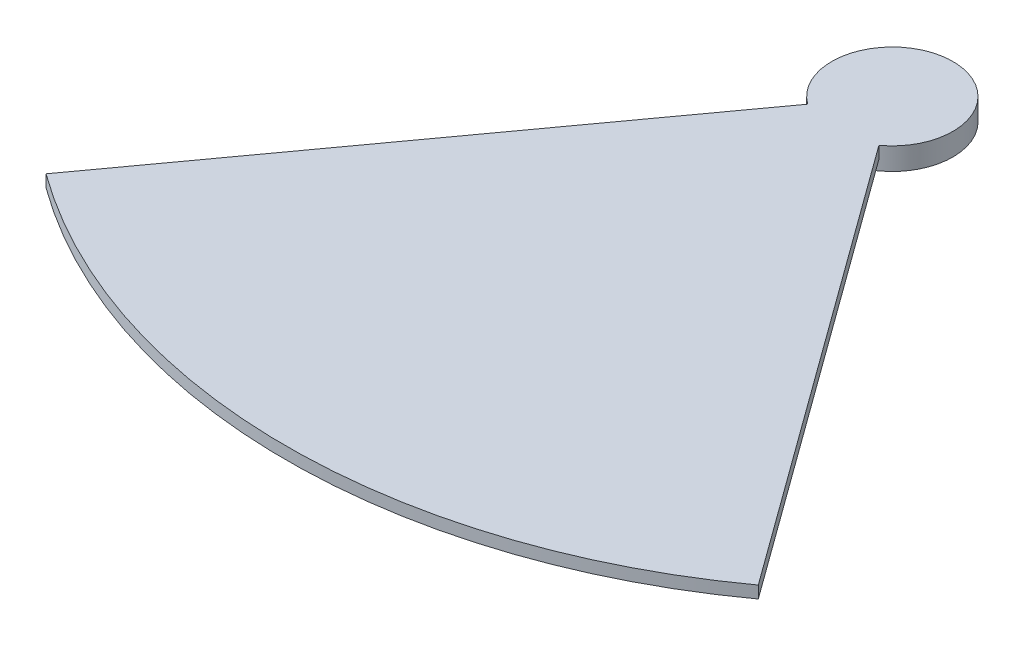
ISO-10303-21;
HEADER;
FILE_DESCRIPTION(('STEP AP214'),'2;1');
FILE_NAME('part.step','',(''),(''),'','','');
FILE_SCHEMA(('AUTOMOTIVE_DESIGN { 1 0 10303 214 1 1 1 1 }'));
ENDSEC;
DATA;
#1=APPLICATION_CONTEXT('core data for automotive mechanical design processes');
#2=APPLICATION_PROTOCOL_DEFINITION('international standard','automotive_design',2000,#1);
#3=PRODUCT_CONTEXT('',#1,'mechanical');
#4=PRODUCT('Part','Part','',(#3));
#5=PRODUCT_RELATED_PRODUCT_CATEGORY('part','',(#4));
#6=PRODUCT_DEFINITION_FORMATION('','',#4);
#7=PRODUCT_DEFINITION_CONTEXT('part definition',#1,'design');
#8=PRODUCT_DEFINITION('design','',#6,#7);
#9=PRODUCT_DEFINITION_SHAPE('','',#8);
#10=(LENGTH_UNIT() NAMED_UNIT(*) SI_UNIT(.MILLI.,.METRE.));
#11=(NAMED_UNIT(*) PLANE_ANGLE_UNIT() SI_UNIT($,.RADIAN.));
#12=(NAMED_UNIT(*) SI_UNIT($,.STERADIAN.) SOLID_ANGLE_UNIT());
#13=UNCERTAINTY_MEASURE_WITH_UNIT(LENGTH_MEASURE(1.E-05),#10,'distance_accuracy_value','');
#14=(GEOMETRIC_REPRESENTATION_CONTEXT(3) GLOBAL_UNCERTAINTY_ASSIGNED_CONTEXT((#13)) GLOBAL_UNIT_ASSIGNED_CONTEXT((#10,
#11,#12)) REPRESENTATION_CONTEXT('',''));
#15=CARTESIAN_POINT('',(0.,0.,0.));
#16=DIRECTION('',(0.,0.,1.));
#17=DIRECTION('',(1.,0.,0.));
#18=AXIS2_PLACEMENT_3D('',#15,#16,#17);
#19=CARTESIAN_POINT('',(0.,0.,0.));
#20=DIRECTION('',(0.,1.,0.));
#21=DIRECTION('',(0.,0.,1.));
#22=AXIS2_PLACEMENT_3D('',#19,#20,#21);
#23=PLANE('',#22);
#24=CARTESIAN_POINT('',(0.,0.,0.));
#25=DIRECTION('',(0.,1.,0.));
#26=DIRECTION('',(0.,0.,1.));
#27=AXIS2_PLACEMENT_3D('',#24,#25,#26);
#28=CIRCLE('',#27,6.);
#29=CARTESIAN_POINT('',(0.,0.,6.));
#30=VERTEX_POINT('',#29);
#31=EDGE_CURVE('E43',#30,#30,#28,.T.);
#32=ORIENTED_EDGE('',*,*,#31,.F.);
#33=EDGE_LOOP('',(#32));
#34=FACE_BOUND('',#33,.T.);
#35=CARTESIAN_POINT('',(0.,0.,0.));
#36=DIRECTION('',(0.,1.,0.));
#37=DIRECTION('',(0.,0.,1.));
#38=AXIS2_PLACEMENT_3D('',#35,#36,#37);
#39=CIRCLE('',#38,3.175);
#40=CARTESIAN_POINT('',(0.,0.,3.175));
#41=VERTEX_POINT('',#40);
#42=EDGE_CURVE('E138',#41,#41,#39,.T.);
#43=ORIENTED_EDGE('',*,*,#42,.T.);
#44=EDGE_LOOP('',(#43));
#45=FACE_BOUND('',#44,.T.);
#46=ADVANCED_FACE('F39',(#34,#45),#23,.F.);
#47=CARTESIAN_POINT('',(0.,16.,0.));
#48=DIRECTION('',(0.,-1.,0.));
#49=DIRECTION('',(0.,0.,-1.));
#50=AXIS2_PLACEMENT_3D('',#47,#48,#49);
#51=CYLINDRICAL_SURFACE('',#50,6.);
#52=CARTESIAN_POINT('',(0.,16.,0.));
#53=DIRECTION('',(0.,1.,0.));
#54=DIRECTION('',(0.,0.,1.));
#55=AXIS2_PLACEMENT_3D('',#52,#53,#54);
#56=CIRCLE('',#55,6.);
#57=CARTESIAN_POINT('',(0.,16.,6.));
#58=VERTEX_POINT('',#57);
#59=EDGE_CURVE('E11',#58,#58,#56,.T.);
#60=ORIENTED_EDGE('',*,*,#59,.F.);
#61=EDGE_LOOP('',(#60));
#62=FACE_BOUND('',#61,.T.);
#63=ORIENTED_EDGE('',*,*,#31,.T.);
#64=EDGE_LOOP('',(#63));
#65=FACE_BOUND('',#64,.T.);
#66=ADVANCED_FACE('F41',(#62,#65),#51,.T.);
#67=CARTESIAN_POINT('',(0.,16.,0.));
#68=DIRECTION('',(0.,-1.,0.));
#69=DIRECTION('',(0.,0.,-1.));
#70=AXIS2_PLACEMENT_3D('',#67,#68,#69);
#71=CYLINDRICAL_SURFACE('',#70,3.175);
#72=CARTESIAN_POINT('',(0.,16.,0.));
#73=DIRECTION('',(0.,1.,0.));
#74=DIRECTION('',(0.,0.,1.));
#75=AXIS2_PLACEMENT_3D('',#72,#73,#74);
#76=CIRCLE('',#75,3.175);
#77=CARTESIAN_POINT('',(0.,16.,3.175));
#78=VERTEX_POINT('',#77);
#79=EDGE_CURVE('E131',#78,#78,#76,.T.);
#80=ORIENTED_EDGE('',*,*,#79,.T.);
#81=EDGE_LOOP('',(#80));
#82=FACE_BOUND('',#81,.T.);
#83=ORIENTED_EDGE('',*,*,#42,.F.);
#84=EDGE_LOOP('',(#83));
#85=FACE_BOUND('',#84,.T.);
#86=ADVANCED_FACE('F152',(#82,#85),#71,.F.);
#87=CARTESIAN_POINT('',(0.,16.,0.));
#88=DIRECTION('',(0.,1.,0.));
#89=DIRECTION('',(0.,0.,1.));
#90=AXIS2_PLACEMENT_3D('',#87,#88,#89);
#91=PLANE('',#90);
#92=ORIENTED_EDGE('',*,*,#79,.F.);
#93=EDGE_LOOP('',(#92));
#94=FACE_BOUND('',#93,.T.);
#95=ADVANCED_FACE('F157',(#94),#91,.F.);
#96=CARTESIAN_POINT('',(0.,21.,0.));
#97=DIRECTION('',(0.,-1.,0.));
#98=DIRECTION('',(0.,0.,-1.));
#99=AXIS2_PLACEMENT_3D('',#96,#97,#98);
#100=CYLINDRICAL_SURFACE('',#99,30.);
#101=CARTESIAN_POINT('',(0.,21.,0.));
#102=DIRECTION('',(0.,1.,0.));
#103=DIRECTION('',(0.,0.,1.));
#104=AXIS2_PLACEMENT_3D('',#101,#102,#103);
#105=CIRCLE('',#104,30.);
#106=CARTESIAN_POINT('',(-17.6335575687744,21.,24.2705098312483));
#107=VERTEX_POINT('',#106);
#108=CARTESIAN_POINT('',(17.6335575687741,21.,24.2705098312485));
#109=VERTEX_POINT('',#108);
#110=EDGE_CURVE('E55',#107,#109,#105,.T.);
#111=ORIENTED_EDGE('',*,*,#110,.F.);
#112=DIRECTION('',(0.,-1.,0.));
#113=VECTOR('',#112,1.);
#114=CARTESIAN_POINT('',(-17.6335575687744,27.,24.2705098312483));
#115=LINE('',#114,#113);
#116=CARTESIAN_POINT('',(-17.6335575687744,27.,24.2705098312483));
#117=VERTEX_POINT('',#116);
#118=EDGE_CURVE('E102',#117,#107,#115,.T.);
#119=ORIENTED_EDGE('',*,*,#118,.F.);
#120=CARTESIAN_POINT('',(0.,27.,0.));
#121=DIRECTION('',(0.,1.,0.));
#122=DIRECTION('',(0.,0.,1.));
#123=AXIS2_PLACEMENT_3D('',#120,#121,#122);
#124=CIRCLE('',#123,30.);
#125=CARTESIAN_POINT('',(17.6335575687741,27.,24.2705098312485));
#126=VERTEX_POINT('',#125);
#127=EDGE_CURVE('E92',#126,#117,#124,.T.);
#128=ORIENTED_EDGE('',*,*,#127,.F.);
#129=DIRECTION('',(0.,-1.,0.));
#130=VECTOR('',#129,1.);
#131=CARTESIAN_POINT('',(17.6335575687741,27.,24.2705098312485));
#132=LINE('',#131,#130);
#133=EDGE_CURVE('E110',#126,#109,#132,.T.);
#134=ORIENTED_EDGE('',*,*,#133,.T.);
#135=EDGE_LOOP('',(#111,#119,#128,#134));
#136=FACE_BOUND('',#135,.T.);
#137=CARTESIAN_POINT('',(0.,16.,0.));
#138=DIRECTION('',(0.,1.,0.));
#139=DIRECTION('',(0.,0.,1.));
#140=AXIS2_PLACEMENT_3D('',#137,#138,#139);
#141=CIRCLE('',#140,30.);
#142=CARTESIAN_POINT('',(0.,16.,30.));
#143=VERTEX_POINT('',#142);
#144=EDGE_CURVE('E128',#143,#143,#141,.T.);
#145=ORIENTED_EDGE('',*,*,#144,.T.);
#146=EDGE_LOOP('',(#145));
#147=FACE_BOUND('',#146,.T.);
#148=ADVANCED_FACE('F159',(#136,#147),#100,.T.);
#149=ORIENTED_EDGE('',*,*,#59,.T.);
#150=EDGE_LOOP('',(#149));
#151=FACE_BOUND('',#150,.T.);
#152=ORIENTED_EDGE('',*,*,#144,.F.);
#153=EDGE_LOOP('',(#152));
#154=FACE_BOUND('',#153,.T.);
#155=ADVANCED_FACE('F162',(#151,#154),#91,.F.);
#156=CARTESIAN_POINT('',(0.,21.,0.));
#157=DIRECTION('',(0.,1.,0.));
#158=DIRECTION('',(0.,0.,1.));
#159=AXIS2_PLACEMENT_3D('',#156,#157,#158);
#160=PLANE('',#159);
#161=DIRECTION('',(-0.58778525229248,0.,0.809016994374942));
#162=VECTOR('',#161,1.);
#163=CARTESIAN_POINT('',(-17.6335575687744,21.,24.2705098312483));
#164=LINE('',#163,#162);
#165=CARTESIAN_POINT('',(-176.335575687744,21.,242.705098312483));
#166=VERTEX_POINT('',#165);
#167=EDGE_CURVE('E98',#107,#166,#164,.T.);
#168=ORIENTED_EDGE('',*,*,#167,.F.);
#169=ORIENTED_EDGE('',*,*,#110,.T.);
#170=DIRECTION('',(-0.587785252292468,0.,-0.809016994374951));
#171=VECTOR('',#170,1.);
#172=CARTESIAN_POINT('',(17.6335575687741,21.,24.2705098312485));
#173=LINE('',#172,#171);
#174=CARTESIAN_POINT('',(176.335575687741,21.,242.705098312485));
#175=VERTEX_POINT('',#174);
#176=EDGE_CURVE('E119',#175,#109,#173,.T.);
#177=ORIENTED_EDGE('',*,*,#176,.F.);
#178=CARTESIAN_POINT('',(0.,21.,0.));
#179=DIRECTION('',(0.,1.,0.));
#180=DIRECTION('',(0.,0.,1.));
#181=AXIS2_PLACEMENT_3D('',#178,#179,#180);
#182=CIRCLE('',#181,300.);
#183=EDGE_CURVE('E116',#166,#175,#182,.T.);
#184=ORIENTED_EDGE('',*,*,#183,.F.);
#185=EDGE_LOOP('',(#168,#169,#177,#184));
#186=FACE_BOUND('',#185,.T.);
#187=ADVANCED_FACE('F165',(#186),#160,.F.);
#188=CARTESIAN_POINT('',(-17.6335575687744,27.,24.2705098312483));
#189=DIRECTION('',(0.809016994374942,0.,0.58778525229248));
#190=DIRECTION('',(0.58778525229248,0.,-0.809016994374942));
#191=AXIS2_PLACEMENT_3D('',#188,#189,#190);
#192=PLANE('',#191);
#193=ORIENTED_EDGE('',*,*,#167,.T.);
#194=DIRECTION('',(0.,-1.,0.));
#195=VECTOR('',#194,1.);
#196=CARTESIAN_POINT('',(-176.335575687744,27.,242.705098312483));
#197=LINE('',#196,#195);
#198=CARTESIAN_POINT('',(-176.335575687744,27.,242.705098312483));
#199=VERTEX_POINT('',#198);
#200=EDGE_CURVE('E96',#199,#166,#197,.T.);
#201=ORIENTED_EDGE('',*,*,#200,.F.);
#202=DIRECTION('',(-0.58778525229248,0.,0.809016994374942));
#203=VECTOR('',#202,1.);
#204=CARTESIAN_POINT('',(-17.6335575687744,27.,24.2705098312483));
#205=LINE('',#204,#203);
#206=EDGE_CURVE('E86',#117,#199,#205,.T.);
#207=ORIENTED_EDGE('',*,*,#206,.F.);
#208=ORIENTED_EDGE('',*,*,#118,.T.);
#209=EDGE_LOOP('',(#193,#201,#207,#208));
#210=FACE_BOUND('',#209,.T.);
#211=ADVANCED_FACE('F97',(#210),#192,.F.);
#212=CARTESIAN_POINT('',(0.,27.,0.));
#213=DIRECTION('',(0.,-1.,0.));
#214=DIRECTION('',(0.,0.,-1.));
#215=AXIS2_PLACEMENT_3D('',#212,#213,#214);
#216=CYLINDRICAL_SURFACE('',#215,300.);
#217=ORIENTED_EDGE('',*,*,#183,.T.);
#218=DIRECTION('',(0.,-1.,0.));
#219=VECTOR('',#218,1.);
#220=CARTESIAN_POINT('',(176.335575687741,27.,242.705098312485));
#221=LINE('',#220,#219);
#222=CARTESIAN_POINT('',(176.335575687741,27.,242.705098312485));
#223=VERTEX_POINT('',#222);
#224=EDGE_CURVE('E103',#223,#175,#221,.T.);
#225=ORIENTED_EDGE('',*,*,#224,.F.);
#226=CARTESIAN_POINT('',(0.,27.,0.));
#227=DIRECTION('',(0.,1.,0.));
#228=DIRECTION('',(0.,0.,1.));
#229=AXIS2_PLACEMENT_3D('',#226,#227,#228);
#230=CIRCLE('',#229,300.);
#231=EDGE_CURVE('E89',#199,#223,#230,.T.);
#232=ORIENTED_EDGE('',*,*,#231,.F.);
#233=ORIENTED_EDGE('',*,*,#200,.T.);
#234=EDGE_LOOP('',(#217,#225,#232,#233));
#235=FACE_BOUND('',#234,.T.);
#236=ADVANCED_FACE('F105',(#235),#216,.T.);
#237=CARTESIAN_POINT('',(17.6335575687741,27.,24.2705098312485));
#238=DIRECTION('',(-0.809016994374951,0.,0.587785252292468));
#239=DIRECTION('',(0.587785252292468,0.,0.809016994374951));
#240=AXIS2_PLACEMENT_3D('',#237,#238,#239);
#241=PLANE('',#240);
#242=ORIENTED_EDGE('',*,*,#176,.T.);
#243=ORIENTED_EDGE('',*,*,#133,.F.);
#244=DIRECTION('',(-0.587785252292468,0.,-0.809016994374951));
#245=VECTOR('',#244,1.);
#246=CARTESIAN_POINT('',(17.6335575687741,27.,24.2705098312485));
#247=LINE('',#246,#245);
#248=EDGE_CURVE('E64',#223,#126,#247,.T.);
#249=ORIENTED_EDGE('',*,*,#248,.F.);
#250=ORIENTED_EDGE('',*,*,#224,.T.);
#251=EDGE_LOOP('',(#242,#243,#249,#250));
#252=FACE_BOUND('',#251,.T.);
#253=ADVANCED_FACE('F171',(#252),#241,.F.);
#254=CARTESIAN_POINT('',(0.,27.,0.));
#255=DIRECTION('',(0.,1.,0.));
#256=DIRECTION('',(0.,0.,1.));
#257=AXIS2_PLACEMENT_3D('',#254,#255,#256);
#258=PLANE('',#257);
#259=ORIENTED_EDGE('',*,*,#127,.T.);
#260=ORIENTED_EDGE('',*,*,#206,.T.);
#261=ORIENTED_EDGE('',*,*,#231,.T.);
#262=ORIENTED_EDGE('',*,*,#248,.T.);
#263=EDGE_LOOP('',(#259,#260,#261,#262));
#264=FACE_BOUND('',#263,.T.);
#265=ADVANCED_FACE('F87',(#264),#258,.T.);
#266=CLOSED_SHELL('',(#46,#66,#86,#95,#148,#155,#187,#211,#236,#253,#265));
#267=MANIFOLD_SOLID_BREP('B2',#266);
#268=ADVANCED_BREP_SHAPE_REPRESENTATION('',(#18,#267),#14);
#269=SHAPE_DEFINITION_REPRESENTATION(#9,#268);
ENDSEC;
END-ISO-10303-21;
